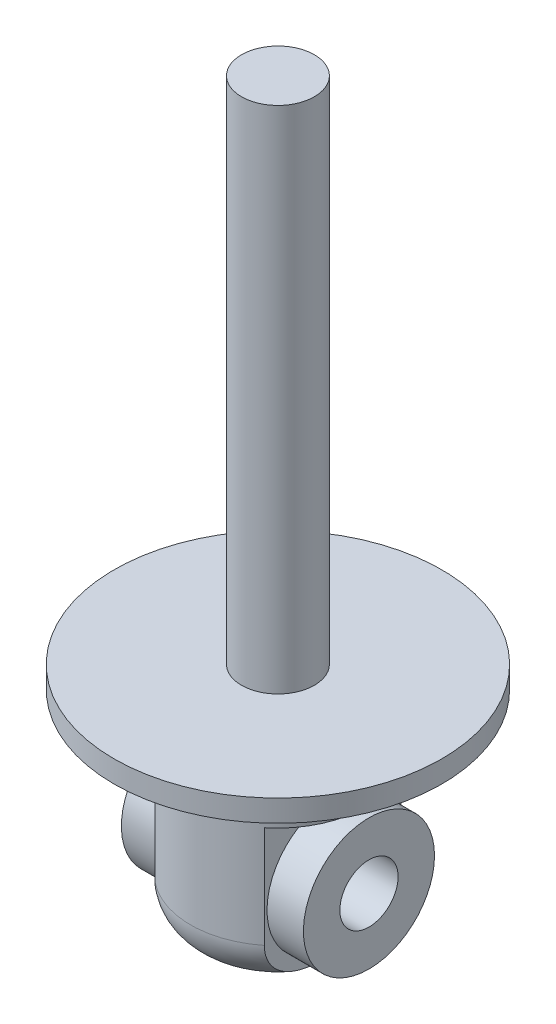
ISO-10303-21;
HEADER;
FILE_DESCRIPTION(('STEP AP214'),'2;1');
FILE_NAME('part.step','',(''),(''),'','','');
FILE_SCHEMA(('AUTOMOTIVE_DESIGN { 1 0 10303 214 1 1 1 1 }'));
ENDSEC;
DATA;
#1=APPLICATION_CONTEXT('core data for automotive mechanical design processes');
#2=APPLICATION_PROTOCOL_DEFINITION('international standard','automotive_design',2000,#1);
#3=PRODUCT_CONTEXT('',#1,'mechanical');
#4=PRODUCT('Part','Part','',(#3));
#5=PRODUCT_RELATED_PRODUCT_CATEGORY('part','',(#4));
#6=PRODUCT_DEFINITION_FORMATION('','',#4);
#7=PRODUCT_DEFINITION_CONTEXT('part definition',#1,'design');
#8=PRODUCT_DEFINITION('design','',#6,#7);
#9=PRODUCT_DEFINITION_SHAPE('','',#8);
#10=(LENGTH_UNIT() NAMED_UNIT(*) SI_UNIT(.MILLI.,.METRE.));
#11=(NAMED_UNIT(*) PLANE_ANGLE_UNIT() SI_UNIT($,.RADIAN.));
#12=(NAMED_UNIT(*) SI_UNIT($,.STERADIAN.) SOLID_ANGLE_UNIT());
#13=UNCERTAINTY_MEASURE_WITH_UNIT(LENGTH_MEASURE(1.E-05),#10,'distance_accuracy_value','');
#14=(GEOMETRIC_REPRESENTATION_CONTEXT(3) GLOBAL_UNCERTAINTY_ASSIGNED_CONTEXT((#13)) GLOBAL_UNIT_ASSIGNED_CONTEXT((#10,
#11,#12)) REPRESENTATION_CONTEXT('',''));
#15=CARTESIAN_POINT('',(0.,0.,0.));
#16=DIRECTION('',(0.,0.,1.));
#17=DIRECTION('',(1.,0.,0.));
#18=AXIS2_PLACEMENT_3D('',#15,#16,#17);
#19=CARTESIAN_POINT('',(-7.5,-8.,-22.5));
#20=DIRECTION('',(1.,0.,0.));
#21=DIRECTION('',(0.,1.,0.));
#22=AXIS2_PLACEMENT_3D('',#19,#20,#21);
#23=PLANE('',#22);
#24=CARTESIAN_POINT('',(-7.5,-27.8094750193111,0.));
#25=CARTESIAN_POINT('',(-7.5,-27.8094752958151,0.18452162824242));
#26=CARTESIAN_POINT('',(-7.5,-27.8077270322999,0.369043480287192));
#27=CARTESIAN_POINT('',(-7.5,-27.8006130628877,0.737999394292285));
#28=CARTESIAN_POINT('',(-7.5,-27.7952477367066,0.922433463434385));
#29=CARTESIAN_POINT('',(-7.5,-27.780538513706,1.29122559425462));
#30=CARTESIAN_POINT('',(-7.5,-27.7711929215574,1.47558358999919));
#31=CARTESIAN_POINT('',(-7.5,-27.7479507640883,1.84401846668315));
#32=CARTESIAN_POINT('',(-7.5,-27.734054140347,2.02809534398339));
#33=CARTESIAN_POINT('',(-7.5,-27.701027325669,2.39498843631837));
#34=CARTESIAN_POINT('',(-7.5,-27.6819201299087,2.57780665418326));
#35=CARTESIAN_POINT('',(-7.5,-27.6375682217561,2.94269408038083));
#36=CARTESIAN_POINT('',(-7.5,-27.6123230495969,3.12476323156505));
#37=CARTESIAN_POINT('',(-7.5,-27.5259360262262,3.6691632505479));
#38=CARTESIAN_POINT('',(-7.5,-27.4541196223952,4.02997739530099));
#39=CARTESIAN_POINT('',(-7.5,-27.315114172541,4.57935988961709));
#40=CARTESIAN_POINT('',(-7.5,-27.2608348848703,4.77122256452969));
#41=CARTESIAN_POINT('',(-7.5,-27.1402411036094,5.15109529504942));
#42=CARTESIAN_POINT('',(-7.5,-27.0739312594077,5.33910680786539));
#43=CARTESIAN_POINT('',(-7.5,-26.928148698992,5.70992505463463));
#44=CARTESIAN_POINT('',(-7.5,-26.8486797977089,5.8927332791208));
#45=CARTESIAN_POINT('',(-7.5,-26.6756224712841,6.25155879665883));
#46=CARTESIAN_POINT('',(-7.5,-26.5820364486502,6.42757723883459));
#47=CARTESIAN_POINT('',(-7.5,-26.3958384208508,6.74413785402998));
#48=CARTESIAN_POINT('',(-7.5,-26.3053527427416,6.8859302136676));
#49=CARTESIAN_POINT('',(-7.5,-26.1136422044668,7.16205254122039));
#50=CARTESIAN_POINT('',(-7.5,-26.0124194056704,7.29638393401336));
#51=CARTESIAN_POINT('',(-7.5,-25.7991822855038,7.55627452274061));
#52=CARTESIAN_POINT('',(-7.5,-25.6871652583255,7.6818315054992));
#53=CARTESIAN_POINT('',(-7.5,-25.4525813942248,7.92270374400352));
#54=CARTESIAN_POINT('',(-7.5,-25.3300144777409,8.03801892249803));
#55=CARTESIAN_POINT('',(-7.5,-25.0736714823962,8.25792234562975));
#56=CARTESIAN_POINT('',(-7.5,-24.9398051473305,8.36240569865935));
#57=CARTESIAN_POINT('',(-7.5,-24.662616920615,8.55796576900281));
#58=CARTESIAN_POINT('',(-7.5,-24.5192963548439,8.64904436046083));
#59=CARTESIAN_POINT('',(-7.5,-24.2243409104845,8.81636481076627));
#60=CARTESIAN_POINT('',(-7.5,-24.0727112205184,8.89261579636783));
#61=CARTESIAN_POINT('',(-7.5,-23.7624095052739,9.02909243430965));
#62=CARTESIAN_POINT('',(-7.5,-23.6037388369551,9.08932115899453));
#63=CARTESIAN_POINT('',(-7.5,-23.3052245459151,9.1849514334904));
#64=CARTESIAN_POINT('',(-7.5,-23.1661361294911,9.22272405795734));
#65=CARTESIAN_POINT('',(-7.5,-22.8851087613884,9.28547940350164));
#66=CARTESIAN_POINT('',(-7.5,-22.7431701638949,9.31046370365637));
#67=CARTESIAN_POINT('',(-7.5,-22.4576599589478,9.34730641699015));
#68=CARTESIAN_POINT('',(-7.5,-22.3140890586128,9.35917031033292));
#69=CARTESIAN_POINT('',(-7.5,-22.0264648581988,9.36963164548865));
#70=CARTESIAN_POINT('',(-7.5,-21.8824115750842,9.36822954903948));
#71=CARTESIAN_POINT('',(-7.5,-21.6061914815275,9.35280339576898));
#72=CARTESIAN_POINT('',(-7.5,-21.4739684759153,9.33976569953801));
#73=CARTESIAN_POINT('',(-7.5,-21.2110534946456,9.3025636387872));
#74=CARTESIAN_POINT('',(-7.5,-21.0803620180608,9.27839574533066));
#75=CARTESIAN_POINT('',(-7.5,-20.8215410609612,9.21922065645586));
#76=CARTESIAN_POINT('',(-7.5,-20.6934101253726,9.18421981495561));
#77=CARTESIAN_POINT('',(-7.5,-20.4404340442512,9.1037455253616));
#78=CARTESIAN_POINT('',(-7.5,-20.3155901493276,9.05826815366643));
#79=CARTESIAN_POINT('',(-7.5,-20.0692031015505,8.95699564520569));
#80=CARTESIAN_POINT('',(-7.5,-19.9476868658852,8.90113499399756));
#81=CARTESIAN_POINT('',(-7.5,-19.7094920695403,8.77987692751897));
#82=CARTESIAN_POINT('',(-7.5,-19.5928152563103,8.71447610526943));
#83=CARTESIAN_POINT('',(-7.5,-19.2509911073174,8.50489875856372));
#84=CARTESIAN_POINT('',(-7.5,-19.0339195251877,8.34729299116935));
#85=CARTESIAN_POINT('',(-7.5,-18.609337427954,7.98870608163153));
#86=CARTESIAN_POINT('',(-7.5,-18.4039002281567,7.78529755950601));
#87=CARTESIAN_POINT('',(-7.5,-18.0246758733926,7.35109040646743));
#88=CARTESIAN_POINT('',(-7.5,-17.8508837047537,7.12029612399675));
#89=CARTESIAN_POINT('',(-7.5,-17.5744409595824,6.69864287979115));
#90=CARTESIAN_POINT('',(-7.5,-17.4648689537028,6.51223410047273));
#91=CARTESIAN_POINT('',(-7.5,-17.2626904112623,6.13034538679086));
#92=CARTESIAN_POINT('',(-7.5,-17.1700919878543,5.93486117014359));
#93=CARTESIAN_POINT('',(-7.5,-17.0006313082269,5.53658641063458));
#94=CARTESIAN_POINT('',(-7.5,-16.9238147555949,5.33377659321381));
#95=CARTESIAN_POINT('',(-7.5,-16.784875362625,4.92331428460811));
#96=CARTESIAN_POINT('',(-7.5,-16.7227484430634,4.71566315546475));
#97=CARTESIAN_POINT('',(-7.5,-16.5386673542946,4.02250667384636));
#98=CARTESIAN_POINT('',(-7.5,-16.4449803111871,3.52942656369882));
#99=CARTESIAN_POINT('',(-7.5,-16.3412352530644,2.78498720051467));
#100=CARTESIAN_POINT('',(-7.5,-16.3127705467372,2.53568557770051));
#101=CARTESIAN_POINT('',(-7.5,-16.2658269581612,2.0361243493744));
#102=CARTESIAN_POINT('',(-7.5,-16.2473468655649,1.78586486368143));
#103=CARTESIAN_POINT('',(-7.5,-16.2184283009414,1.28363112408654));
#104=CARTESIAN_POINT('',(-7.5,-16.208031590786,1.03165466176093));
#105=CARTESIAN_POINT('',(-7.5,-16.1941849220444,0.527501194688693));
#106=CARTESIAN_POINT('',(-7.5,-16.1907352988047,0.275324180848924));
#107=CARTESIAN_POINT('',(-7.5,-16.1903333462322,-0.228731345602963));
#108=CARTESIAN_POINT('',(-7.5,-16.193373232494,-0.480609853630161));
#109=CARTESIAN_POINT('',(-7.5,-16.2063332691715,-0.984173581494253));
#110=CARTESIAN_POINT('',(-7.5,-16.2162528039696,-1.23585881660872));
#111=CARTESIAN_POINT('',(-7.5,-16.2454935008677,-1.76278825668932));
#112=CARTESIAN_POINT('',(-7.5,-16.2656211327378,-2.0379899010917));
#113=CARTESIAN_POINT('',(-7.5,-16.3180418431017,-2.58731345976838));
#114=CARTESIAN_POINT('',(-7.5,-16.3503365349836,-2.86143522597443));
#115=CARTESIAN_POINT('',(-7.5,-16.4300545548583,-3.40623279358436));
#116=CARTESIAN_POINT('',(-7.5,-16.4774071358833,-3.67691867401873));
#117=CARTESIAN_POINT('',(-7.5,-16.5907053400646,-4.21439476079951));
#118=CARTESIAN_POINT('',(-7.5,-16.6566449229111,-4.4811862031647));
#119=CARTESIAN_POINT('',(-7.5,-16.7911834026755,-4.94217748017443));
#120=CARTESIAN_POINT('',(-7.5,-16.8549558474619,-5.13778160857807));
#121=CARTESIAN_POINT('',(-7.5,-16.9961265709521,-5.5239942274174));
#122=CARTESIAN_POINT('',(-7.5,-17.0735207892669,-5.71460418712136));
#123=CARTESIAN_POINT('',(-7.5,-17.2430793617625,-6.08921987221889));
#124=CARTESIAN_POINT('',(-7.5,-17.3352463319138,-6.27322442084438));
#125=CARTESIAN_POINT('',(-7.5,-17.5351759469553,-6.63256976145457));
#126=CARTESIAN_POINT('',(-7.5,-17.6429345063483,-6.80791280693597));
#127=CARTESIAN_POINT('',(-7.5,-17.8487615005736,-7.10989658300674));
#128=CARTESIAN_POINT('',(-7.5,-17.9436617626469,-7.23870103997639));
#129=CARTESIAN_POINT('',(-7.5,-18.143229826346,-7.48856622066219));
#130=CARTESIAN_POINT('',(-7.5,-18.2478987883735,-7.60962602152205));
#131=CARTESIAN_POINT('',(-7.5,-18.4668045949393,-7.84271387792474));
#132=CARTESIAN_POINT('',(-7.5,-18.5810384459287,-7.95474473789612));
#133=CARTESIAN_POINT('',(-7.5,-18.8187268203134,-8.16854933672494));
#134=CARTESIAN_POINT('',(-7.5,-18.9421800591116,-8.27032449994957));
#135=CARTESIAN_POINT('',(-7.5,-19.1987356397018,-8.46313596223061));
#136=CARTESIAN_POINT('',(-7.5,-19.3319055781875,-8.55408255407203));
#137=CARTESIAN_POINT('',(-7.5,-19.6061418402457,-8.72304401015934));
#138=CARTESIAN_POINT('',(-7.5,-19.747204378254,-8.80106500403696));
#139=CARTESIAN_POINT('',(-7.5,-20.0362068877473,-8.94309470867639));
#140=CARTESIAN_POINT('',(-7.5,-20.1841460034049,-9.00710515749598));
#141=CARTESIAN_POINT('',(-7.5,-20.4856380297523,-9.12014361193693));
#142=CARTESIAN_POINT('',(-7.5,-20.6391901444676,-9.16917373274798));
#143=CARTESIAN_POINT('',(-7.5,-20.9313639562727,-9.24643392787081));
#144=CARTESIAN_POINT('',(-7.5,-21.0695088202567,-9.2764768563288));
#145=CARTESIAN_POINT('',(-7.5,-21.3479315795213,-9.32406143536891));
#146=CARTESIAN_POINT('',(-7.5,-21.4882092809526,-9.34160421520928));
#147=CARTESIAN_POINT('',(-7.5,-21.769719609589,-9.36396002322678));
#148=CARTESIAN_POINT('',(-7.5,-21.9109518422674,-9.36877802253041));
#149=CARTESIAN_POINT('',(-7.5,-22.1932734390957,-9.36563613906261));
#150=CARTESIAN_POINT('',(-7.5,-22.3343628067459,-9.35767657732182));
#151=CARTESIAN_POINT('',(-7.5,-22.6064011749062,-9.32998563551062));
#152=CARTESIAN_POINT('',(-7.5,-22.7374295539783,-9.31102660205279));
#153=CARTESIAN_POINT('',(-7.5,-22.9974780227225,-9.26218788836622));
#154=CARTESIAN_POINT('',(-7.5,-23.1264974548056,-9.23230470755187));
#155=CARTESIAN_POINT('',(-7.5,-23.3815508516768,-9.16196479385525));
#156=CARTESIAN_POINT('',(-7.5,-23.5075862018083,-9.12151307666088));
#157=CARTESIAN_POINT('',(-7.5,-23.7559772755244,-9.03044888037393));
#158=CARTESIAN_POINT('',(-7.5,-23.8783315975104,-8.97983258590814));
#159=CARTESIAN_POINT('',(-7.5,-24.1205569584555,-8.8680617574251));
#160=CARTESIAN_POINT('',(-7.5,-24.2403549182387,-8.80674877020291));
#161=CARTESIAN_POINT('',(-7.5,-24.4747211723639,-8.67480187441993));
#162=CARTESIAN_POINT('',(-7.5,-24.5892875713423,-8.60416462323317));
#163=CARTESIAN_POINT('',(-7.5,-24.9242270275788,-8.37928997825773));
#164=CARTESIAN_POINT('',(-7.5,-25.13600210755,-8.21201407264852));
#165=CARTESIAN_POINT('',(-7.5,-25.5504485361803,-7.832942739178));
#166=CARTESIAN_POINT('',(-7.5,-25.7507010772538,-7.618532285847));
#167=CARTESIAN_POINT('',(-7.5,-26.1185076671662,-7.16337882817298));
#168=CARTESIAN_POINT('',(-7.5,-26.2860513710234,-6.9226275303298));
#169=CARTESIAN_POINT('',(-7.5,-26.5545024709803,-6.4788664395953));
#170=CARTESIAN_POINT('',(-7.5,-26.6619013252763,-6.279707295078));
#171=CARTESIAN_POINT('',(-7.5,-26.858559219587,-5.87254463104013));
#172=CARTESIAN_POINT('',(-7.5,-26.9478095430477,-5.66453691936401));
#173=CARTESIAN_POINT('',(-7.5,-27.1096214973705,-5.24180758530233));
#174=CARTESIAN_POINT('',(-7.5,-27.1821555960046,-5.02707553901332));
#175=CARTESIAN_POINT('',(-7.5,-27.3121001369762,-4.59305326757356));
#176=CARTESIAN_POINT('',(-7.5,-27.3695048137837,-4.37376133898657));
#177=CARTESIAN_POINT('',(-7.5,-27.4981886749365,-3.81417726059937));
#178=CARTESIAN_POINT('',(-7.5,-27.5604951716191,-3.4718329690517));
#179=CARTESIAN_POINT('',(-7.5,-27.6609019684328,-2.7835920061487));
#180=CARTESIAN_POINT('',(-7.5,-27.6989863972919,-2.43769315620305));
#181=CARTESIAN_POINT('',(-7.5,-27.7425563308733,-1.91723181279188));
#182=CARTESIAN_POINT('',(-7.5,-27.7548291128016,-1.74318957751326));
#183=CARTESIAN_POINT('',(-7.5,-27.7753986995787,-1.39487161182967));
#184=CARTESIAN_POINT('',(-7.5,-27.7836956019396,-1.22059588725638));
#185=CARTESIAN_POINT('',(-7.5,-27.796777523185,-0.87196539298604));
#186=CARTESIAN_POINT('',(-7.5,-27.8015635129394,-0.697610658492171));
#187=CARTESIAN_POINT('',(-7.5,-27.8079121855994,-0.348837350643893));
#188=CARTESIAN_POINT('',(-7.5,-27.8094747579462,-0.174418775305038));
#189=CARTESIAN_POINT('',(-7.5,-27.8094750193111,0.));
#190=B_SPLINE_CURVE_WITH_KNOTS('',3,(#24,#25,#26,#27,#28,#29,#30,#31,#32,#33,#34,#35,#36,#37,
#38,#39,#40,#41,#42,#43,#44,#45,#46,#47,#48,#49,#50,#51,#52,#53,#54,#55,#56,#57,#58,#59,#60,#61,
#62,#63,#64,#65,#66,#67,#68,#69,#70,#71,#72,#73,#74,#75,#76,#77,#78,#79,#80,#81,#82,#83,#84,#85,
#86,#87,#88,#89,#90,#91,#92,#93,#94,#95,#96,#97,#98,#99,#100,#101,#102,#103,#104,#105,#106,#107,
#108,#109,#110,#111,#112,#113,#114,#115,#116,#117,#118,#119,#120,#121,#122,#123,#124,#125,#126,
#127,#128,#129,#130,#131,#132,#133,#134,#135,#136,#137,#138,#139,#140,#141,#142,#143,#144,#145,
#146,#147,#148,#149,#150,#151,#152,#153,#154,#155,#156,#157,#158,#159,#160,#161,#162,#163,#164,
#165,#166,#167,#168,#169,#170,#171,#172,#173,#174,#175,#176,#177,#178,#179,#180,#181,#182,#183,
#184,#185,#186,#187,#188,#189),.UNSPECIFIED.,.T.,.F.,(4,2,2,2,2,2,2,2,2,2,2,2,2,2,2,2,2,2,2,2,2,
2,2,2,2,2,2,2,2,2,2,2,2,2,2,2,2,2,2,2,2,2,2,2,2,2,2,2,2,2,2,2,2,2,2,2,2,2,2,2,2,2,2,2,2,2,2,2,2,
2,2,2,2,2,2,2,2,2,2,2,2,2,4),(0.,0.553556541747908,1.10705498067111,1.66078940935171,
2.21453094651203,2.7658672034967,3.31724477121585,4.41912680182767,5.01698525599297,
5.61461314908642,6.21206808675634,6.80942146164093,7.31357153503217,7.81762499361292,
8.32180513447662,8.82598907791493,9.33467160980088,9.84328295415676,10.3515802378956,
10.8597799828438,11.291588037567,11.7233427606026,12.1549170790764,12.5864763761707,
12.9845986570771,13.3828472534997,13.7808627038906,14.1790274594522,14.579795450788,
14.9807069160888,15.7821103743006,16.6461503316802,17.5100532757815,18.1578732554314,
18.8060020817716,19.4559821948789,20.1057815998326,21.6069748462105,22.3596793389022,
23.1122925673176,23.8687687149109,24.6252813779039,25.3808870860739,26.1364251884592,
26.9640249034878,27.7917343993232,28.6156111127982,29.4392203950451,30.0559954213972,
30.6725869093733,31.2892877047367,31.9058271963483,32.3853559200308,32.8649416785199,
33.3443778968313,33.823747436381,34.3068464150844,34.7897156366604,35.2725249226045,
35.7552660053908,36.1788379642465,36.6023716529343,37.0257398573389,37.4490974249689,
37.8458122806135,38.2426543730445,38.639308470493,39.0361117351622,39.4393886143668,
39.8428104576492,40.6491243408277,41.5260051520067,42.403162850804,43.0810551134699,
43.7592721958252,44.4385984678267,45.1181832448308,46.1608437011148,47.2041866484774,
47.7275747628343,48.2509500399341,48.7741805338585,49.2974289735857),.UNSPECIFIED.);
#191=CARTESIAN_POINT('',(-7.5,-22.,-9.3674969975976));
#192=VERTEX_POINT('',#191);
#193=CARTESIAN_POINT('',(-7.5,-21.9999999999999,9.36749699759766));
#194=VERTEX_POINT('',#193);
#195=EDGE_CURVE('E136',#192,#194,#190,.T.);
#196=ORIENTED_EDGE('',*,*,#195,.T.);
#197=DIRECTION('',(0.,1.,0.));
#198=VECTOR('',#197,1.);
#199=CARTESIAN_POINT('',(-7.5,-28.,9.3674969975976));
#200=LINE('',#199,#198);
#201=CARTESIAN_POINT('',(-7.5,-8.,9.36749699759759));
#202=VERTEX_POINT('',#201);
#203=EDGE_CURVE('E99',#202,#194,#200,.F.);
#204=ORIENTED_EDGE('',*,*,#203,.F.);
#205=DIRECTION('',(0.,0.,1.));
#206=VECTOR('',#205,1.);
#207=CARTESIAN_POINT('',(-7.5,-8.,-22.5));
#208=LINE('',#207,#206);
#209=CARTESIAN_POINT('',(-7.5,-8.,-9.36749699759761));
#210=VERTEX_POINT('',#209);
#211=EDGE_CURVE('E92',#210,#202,#208,.T.);
#212=ORIENTED_EDGE('',*,*,#211,.F.);
#213=DIRECTION('',(0.,1.,0.));
#214=VECTOR('',#213,1.);
#215=CARTESIAN_POINT('',(-7.5,-28.,-9.3674969975976));
#216=LINE('',#215,#214);
#217=EDGE_CURVE('E70',#192,#210,#216,.T.);
#218=ORIENTED_EDGE('',*,*,#217,.F.);
#219=EDGE_LOOP('',(#196,#204,#212,#218));
#220=FACE_BOUND('',#219,.T.);
#221=CARTESIAN_POINT('',(-7.5,-18.,0.));
#222=DIRECTION('',(1.,0.,0.));
#223=DIRECTION('',(0.,1.,0.));
#224=AXIS2_PLACEMENT_3D('',#221,#222,#223);
#225=CIRCLE('',#224,9.);
#226=CARTESIAN_POINT('',(-7.5,-9.,0.));
#227=VERTEX_POINT('',#226);
#228=EDGE_CURVE('E11',#227,#227,#225,.F.);
#229=ORIENTED_EDGE('',*,*,#228,.F.);
#230=EDGE_LOOP('',(#229));
#231=FACE_BOUND('',#230,.T.);
#232=ADVANCED_FACE('F45',(#220,#231),#23,.F.);
#233=CARTESIAN_POINT('',(7.5,-8.,-22.5));
#234=DIRECTION('',(-1.,0.,0.));
#235=DIRECTION('',(0.,-1.,0.));
#236=AXIS2_PLACEMENT_3D('',#233,#234,#235);
#237=PLANE('',#236);
#238=CARTESIAN_POINT('',(7.5,-27.8094750193111,0.));
#239=CARTESIAN_POINT('',(7.5,-27.8094752958151,-0.18452162824242));
#240=CARTESIAN_POINT('',(7.5,-27.8077270322999,-0.369043480287192));
#241=CARTESIAN_POINT('',(7.5,-27.8006130628877,-0.737999394292286));
#242=CARTESIAN_POINT('',(7.5,-27.7952477367066,-0.922433463434386));
#243=CARTESIAN_POINT('',(7.5,-27.780538513706,-1.29122559425462));
#244=CARTESIAN_POINT('',(7.5,-27.7711929215574,-1.47558358999919));
#245=CARTESIAN_POINT('',(7.5,-27.7479507640883,-1.84401846668315));
#246=CARTESIAN_POINT('',(7.5,-27.734054140347,-2.0280953439834));
#247=CARTESIAN_POINT('',(7.5,-27.701027325669,-2.39498843631837));
#248=CARTESIAN_POINT('',(7.5,-27.6819201299087,-2.57780665418327));
#249=CARTESIAN_POINT('',(7.5,-27.6375682217561,-2.94269408038084));
#250=CARTESIAN_POINT('',(7.5,-27.6123230495969,-3.12476323156505));
#251=CARTESIAN_POINT('',(7.5,-27.5259360262262,-3.6691632505479));
#252=CARTESIAN_POINT('',(7.5,-27.4541196223952,-4.029977395301));
#253=CARTESIAN_POINT('',(7.5,-27.315114172541,-4.57935988961709));
#254=CARTESIAN_POINT('',(7.5,-27.2608348848703,-4.7712225645297));
#255=CARTESIAN_POINT('',(7.5,-27.1402411036094,-5.15109529504943));
#256=CARTESIAN_POINT('',(7.5,-27.0739312594077,-5.3391068078654));
#257=CARTESIAN_POINT('',(7.5,-26.9281486989919,-5.70992505463463));
#258=CARTESIAN_POINT('',(7.5,-26.8486797977089,-5.8927332791208));
#259=CARTESIAN_POINT('',(7.5,-26.6756224712841,-6.25155879665883));
#260=CARTESIAN_POINT('',(7.5,-26.5820364486501,-6.4275772388346));
#261=CARTESIAN_POINT('',(7.5,-26.3958384208508,-6.74413785402998));
#262=CARTESIAN_POINT('',(7.5,-26.3053527427416,-6.8859302136676));
#263=CARTESIAN_POINT('',(7.5,-26.1136422044668,-7.16205254122039));
#264=CARTESIAN_POINT('',(7.5,-26.0124194056704,-7.29638393401336));
#265=CARTESIAN_POINT('',(7.5,-25.7991822855038,-7.55627452274061));
#266=CARTESIAN_POINT('',(7.5,-25.6871652583255,-7.6818315054992));
#267=CARTESIAN_POINT('',(7.5,-25.4525813942248,-7.92270374400352));
#268=CARTESIAN_POINT('',(7.5,-25.3300144777409,-8.03801892249803));
#269=CARTESIAN_POINT('',(7.5,-25.0736714823962,-8.25792234562975));
#270=CARTESIAN_POINT('',(7.5,-24.9398051473305,-8.36240569865935));
#271=CARTESIAN_POINT('',(7.5,-24.662616920615,-8.55796576900282));
#272=CARTESIAN_POINT('',(7.5,-24.5192963548439,-8.64904436046083));
#273=CARTESIAN_POINT('',(7.5,-24.2243409104845,-8.81636481076627));
#274=CARTESIAN_POINT('',(7.5,-24.0727112205184,-8.89261579636783));
#275=CARTESIAN_POINT('',(7.5,-23.7624095052739,-9.02909243430965));
#276=CARTESIAN_POINT('',(7.5,-23.6037388369551,-9.08932115899453));
#277=CARTESIAN_POINT('',(7.5,-23.3052245459151,-9.1849514334904));
#278=CARTESIAN_POINT('',(7.5,-23.166136129491,-9.22272405795733));
#279=CARTESIAN_POINT('',(7.5,-22.8851087613884,-9.28547940350164));
#280=CARTESIAN_POINT('',(7.5,-22.7431701638949,-9.31046370365637));
#281=CARTESIAN_POINT('',(7.5,-22.4576599589478,-9.34730641699015));
#282=CARTESIAN_POINT('',(7.5,-22.3140890586128,-9.35917031033292));
#283=CARTESIAN_POINT('',(7.5,-22.0264648581988,-9.36963164548865));
#284=CARTESIAN_POINT('',(7.5,-21.8824115750842,-9.36822954903947));
#285=CARTESIAN_POINT('',(7.5,-21.6061914815275,-9.35280339576898));
#286=CARTESIAN_POINT('',(7.5,-21.4739684759153,-9.33976569953801));
#287=CARTESIAN_POINT('',(7.5,-21.2110534946456,-9.3025636387872));
#288=CARTESIAN_POINT('',(7.5,-21.0803620180608,-9.27839574533066));
#289=CARTESIAN_POINT('',(7.5,-20.8215410609612,-9.21922065645586));
#290=CARTESIAN_POINT('',(7.5,-20.6934101253726,-9.1842198149556));
#291=CARTESIAN_POINT('',(7.5,-20.4404340442512,-9.1037455253616));
#292=CARTESIAN_POINT('',(7.5,-20.3155901493276,-9.05826815366643));
#293=CARTESIAN_POINT('',(7.5,-20.0692031015505,-8.95699564520569));
#294=CARTESIAN_POINT('',(7.5,-19.9476868658852,-8.90113499399755));
#295=CARTESIAN_POINT('',(7.5,-19.7094920695403,-8.77987692751896));
#296=CARTESIAN_POINT('',(7.5,-19.5928152563103,-8.71447610526942));
#297=CARTESIAN_POINT('',(7.5,-19.2509911073174,-8.50489875856371));
#298=CARTESIAN_POINT('',(7.5,-19.0339195251877,-8.34729299116934));
#299=CARTESIAN_POINT('',(7.5,-18.609337427954,-7.98870608163152));
#300=CARTESIAN_POINT('',(7.5,-18.4039002281567,-7.785297559506));
#301=CARTESIAN_POINT('',(7.5,-18.0246758733926,-7.35109040646742));
#302=CARTESIAN_POINT('',(7.5,-17.8508837047537,-7.12029612399674));
#303=CARTESIAN_POINT('',(7.5,-17.5744409595824,-6.69864287979115));
#304=CARTESIAN_POINT('',(7.5,-17.4648689537028,-6.51223410047273));
#305=CARTESIAN_POINT('',(7.5,-17.2626904112623,-6.13034538679085));
#306=CARTESIAN_POINT('',(7.5,-17.1700919878543,-5.93486117014358));
#307=CARTESIAN_POINT('',(7.5,-17.0006313082269,-5.53658641063457));
#308=CARTESIAN_POINT('',(7.5,-16.9238147555949,-5.3337765932138));
#309=CARTESIAN_POINT('',(7.5,-16.784875362625,-4.92331428460809));
#310=CARTESIAN_POINT('',(7.5,-16.7227484430634,-4.71566315546473));
#311=CARTESIAN_POINT('',(7.5,-16.5386673542946,-4.02250667384634));
#312=CARTESIAN_POINT('',(7.5,-16.4449803111871,-3.5294265636988));
#313=CARTESIAN_POINT('',(7.5,-16.3412352530644,-2.78498720051465));
#314=CARTESIAN_POINT('',(7.5,-16.3127705467372,-2.53568557770048));
#315=CARTESIAN_POINT('',(7.5,-16.2658269581612,-2.03612434937437));
#316=CARTESIAN_POINT('',(7.5,-16.2473468655649,-1.78586486368141));
#317=CARTESIAN_POINT('',(7.5,-16.2184283009414,-1.28363112408651));
#318=CARTESIAN_POINT('',(7.5,-16.208031590786,-1.0316546617609));
#319=CARTESIAN_POINT('',(7.5,-16.1941849220444,-0.527501194688664));
#320=CARTESIAN_POINT('',(7.5,-16.1907352988047,-0.275324180848894));
#321=CARTESIAN_POINT('',(7.5,-16.1903333462322,0.228731345602993));
#322=CARTESIAN_POINT('',(7.5,-16.193373232494,0.480609853630191));
#323=CARTESIAN_POINT('',(7.5,-16.2063332691715,0.984173581494284));
#324=CARTESIAN_POINT('',(7.5,-16.2162528039696,1.23585881660876));
#325=CARTESIAN_POINT('',(7.5,-16.2454935008677,1.76278825668935));
#326=CARTESIAN_POINT('',(7.5,-16.2656211327378,2.03798990109173));
#327=CARTESIAN_POINT('',(7.5,-16.3180418431017,2.5873134597684));
#328=CARTESIAN_POINT('',(7.5,-16.3503365349836,2.86143522597445));
#329=CARTESIAN_POINT('',(7.5,-16.4300545548583,3.40623279358438));
#330=CARTESIAN_POINT('',(7.5,-16.4774071358833,3.67691867401874));
#331=CARTESIAN_POINT('',(7.5,-16.5907053400646,4.21439476079952));
#332=CARTESIAN_POINT('',(7.5,-16.6566449229111,4.48118620316471));
#333=CARTESIAN_POINT('',(7.5,-16.7911834026755,4.94217748017443));
#334=CARTESIAN_POINT('',(7.5,-16.8549558474619,5.13778160857808));
#335=CARTESIAN_POINT('',(7.5,-16.9961265709521,5.5239942274174));
#336=CARTESIAN_POINT('',(7.5,-17.073520789267,5.71460418712137));
#337=CARTESIAN_POINT('',(7.5,-17.2430793617625,6.0892198722189));
#338=CARTESIAN_POINT('',(7.5,-17.3352463319138,6.27322442084439));
#339=CARTESIAN_POINT('',(7.5,-17.5351759469553,6.63256976145458));
#340=CARTESIAN_POINT('',(7.5,-17.6429345063483,6.80791280693598));
#341=CARTESIAN_POINT('',(7.5,-17.8487615005737,7.10989658300674));
#342=CARTESIAN_POINT('',(7.5,-17.9436617626469,7.2387010399764));
#343=CARTESIAN_POINT('',(7.5,-18.143229826346,7.4885662206622));
#344=CARTESIAN_POINT('',(7.5,-18.2478987883735,7.60962602152205));
#345=CARTESIAN_POINT('',(7.5,-18.4668045949393,7.84271387792475));
#346=CARTESIAN_POINT('',(7.5,-18.5810384459287,7.95474473789613));
#347=CARTESIAN_POINT('',(7.5,-18.8187268203134,8.16854933672495));
#348=CARTESIAN_POINT('',(7.5,-18.9421800591116,8.27032449994957));
#349=CARTESIAN_POINT('',(7.5,-19.1987356397018,8.46313596223061));
#350=CARTESIAN_POINT('',(7.5,-19.3319055781875,8.55408255407202));
#351=CARTESIAN_POINT('',(7.5,-19.6061418402457,8.72304401015933));
#352=CARTESIAN_POINT('',(7.5,-19.747204378254,8.80106500403696));
#353=CARTESIAN_POINT('',(7.5,-20.0362068877473,8.94309470867639));
#354=CARTESIAN_POINT('',(7.5,-20.1841460034049,9.00710515749598));
#355=CARTESIAN_POINT('',(7.5,-20.4856380297523,9.12014361193692));
#356=CARTESIAN_POINT('',(7.5,-20.6391901444676,9.16917373274798));
#357=CARTESIAN_POINT('',(7.5,-20.9313639562727,9.24643392787081));
#358=CARTESIAN_POINT('',(7.5,-21.0695088202567,9.27647685632879));
#359=CARTESIAN_POINT('',(7.5,-21.3479315795213,9.32406143536891));
#360=CARTESIAN_POINT('',(7.5,-21.4882092809527,9.34160421520928));
#361=CARTESIAN_POINT('',(7.5,-21.769719609589,9.36396002322678));
#362=CARTESIAN_POINT('',(7.5,-21.9109518422674,9.36877802253041));
#363=CARTESIAN_POINT('',(7.5,-22.1932734390957,9.3656361390626));
#364=CARTESIAN_POINT('',(7.5,-22.3343628067459,9.35767657732181));
#365=CARTESIAN_POINT('',(7.5,-22.6064011749062,9.32998563551062));
#366=CARTESIAN_POINT('',(7.5,-22.7374295539783,9.31102660205278));
#367=CARTESIAN_POINT('',(7.5,-22.9974780227225,9.26218788836621));
#368=CARTESIAN_POINT('',(7.5,-23.1264974548056,9.23230470755187));
#369=CARTESIAN_POINT('',(7.5,-23.3815508516768,9.16196479385525));
#370=CARTESIAN_POINT('',(7.5,-23.5075862018083,9.12151307666088));
#371=CARTESIAN_POINT('',(7.5,-23.7559772755244,9.03044888037393));
#372=CARTESIAN_POINT('',(7.5,-23.8783315975104,8.97983258590813));
#373=CARTESIAN_POINT('',(7.5,-24.1205569584555,8.86806175742509));
#374=CARTESIAN_POINT('',(7.5,-24.2403549182387,8.8067487702029));
#375=CARTESIAN_POINT('',(7.5,-24.4747211723639,8.67480187441993));
#376=CARTESIAN_POINT('',(7.5,-24.5892875713423,8.60416462323316));
#377=CARTESIAN_POINT('',(7.5,-24.9242270275788,8.37928997825772));
#378=CARTESIAN_POINT('',(7.5,-25.13600210755,8.21201407264851));
#379=CARTESIAN_POINT('',(7.5,-25.5504485361803,7.83294273917799));
#380=CARTESIAN_POINT('',(7.5,-25.7507010772538,7.61853228584699));
#381=CARTESIAN_POINT('',(7.5,-26.1185076671662,7.16337882817297));
#382=CARTESIAN_POINT('',(7.5,-26.2860513710234,6.92262753032979));
#383=CARTESIAN_POINT('',(7.5,-26.5545024709803,6.47886643959529));
#384=CARTESIAN_POINT('',(7.5,-26.6619013252763,6.27970729507799));
#385=CARTESIAN_POINT('',(7.5,-26.858559219587,5.87254463104012));
#386=CARTESIAN_POINT('',(7.5,-26.9478095430477,5.664536919364));
#387=CARTESIAN_POINT('',(7.5,-27.1096214973705,5.24180758530232));
#388=CARTESIAN_POINT('',(7.5,-27.1821555960046,5.02707553901331));
#389=CARTESIAN_POINT('',(7.5,-27.3121001369762,4.59305326757355));
#390=CARTESIAN_POINT('',(7.5,-27.3695048137837,4.37376133898655));
#391=CARTESIAN_POINT('',(7.5,-27.4981886749365,3.81417726059936));
#392=CARTESIAN_POINT('',(7.5,-27.5604951716191,3.47183296905169));
#393=CARTESIAN_POINT('',(7.5,-27.6609019684328,2.78359200614869));
#394=CARTESIAN_POINT('',(7.5,-27.6989863972919,2.43769315620304));
#395=CARTESIAN_POINT('',(7.5,-27.7425563308733,1.91723181279187));
#396=CARTESIAN_POINT('',(7.5,-27.7548291128016,1.74318957751326));
#397=CARTESIAN_POINT('',(7.5,-27.7753986995787,1.39487161182966));
#398=CARTESIAN_POINT('',(7.5,-27.7836956019396,1.22059588725638));
#399=CARTESIAN_POINT('',(7.5,-27.796777523185,0.871965392986033));
#400=CARTESIAN_POINT('',(7.5,-27.8015635129394,0.697610658492164));
#401=CARTESIAN_POINT('',(7.5,-27.8079121855994,0.348837350643889));
#402=CARTESIAN_POINT('',(7.5,-27.8094747579462,0.174418775305036));
#403=CARTESIAN_POINT('',(7.5,-27.8094750193111,0.));
#404=B_SPLINE_CURVE_WITH_KNOTS('',3,(#238,#239,#240,#241,#242,#243,#244,#245,#246,#247,#248,
#249,#250,#251,#252,#253,#254,#255,#256,#257,#258,#259,#260,#261,#262,#263,#264,#265,#266,#267,
#268,#269,#270,#271,#272,#273,#274,#275,#276,#277,#278,#279,#280,#281,#282,#283,#284,#285,#286,
#287,#288,#289,#290,#291,#292,#293,#294,#295,#296,#297,#298,#299,#300,#301,#302,#303,#304,#305,
#306,#307,#308,#309,#310,#311,#312,#313,#314,#315,#316,#317,#318,#319,#320,#321,#322,#323,#324,
#325,#326,#327,#328,#329,#330,#331,#332,#333,#334,#335,#336,#337,#338,#339,#340,#341,#342,#343,
#344,#345,#346,#347,#348,#349,#350,#351,#352,#353,#354,#355,#356,#357,#358,#359,#360,#361,#362,
#363,#364,#365,#366,#367,#368,#369,#370,#371,#372,#373,#374,#375,#376,#377,#378,#379,#380,#381,
#382,#383,#384,#385,#386,#387,#388,#389,#390,#391,#392,#393,#394,#395,#396,#397,#398,#399,#400,
#401,#402,#403),.UNSPECIFIED.,.T.,.F.,(4,2,2,2,2,2,2,2,2,2,2,2,2,2,2,2,2,2,2,2,2,2,2,2,2,2,2,2,
2,2,2,2,2,2,2,2,2,2,2,2,2,2,2,2,2,2,2,2,2,2,2,2,2,2,2,2,2,2,2,2,2,2,2,2,2,2,2,2,2,2,2,2,2,2,2,2,
2,2,2,2,2,2,4),(0.,0.553556541747909,1.10705498067111,1.66078940935171,2.21453094651203,
2.7658672034967,3.31724477121586,4.41912680182767,5.01698525599298,5.61461314908642,
6.21206808675634,6.80942146164093,7.31357153503217,7.81762499361292,8.32180513447662,
8.82598907791493,9.33467160980088,9.84328295415677,10.3515802378956,10.8597799828438,
11.291588037567,11.7233427606026,12.1549170790764,12.5864763761706,12.9845986570771,
13.3828472534997,13.7808627038906,14.1790274594522,14.579795450788,14.9807069160888,
15.7821103743006,16.6461503316802,17.5100532757815,18.1578732554314,18.8060020817716,
19.4559821948789,20.1057815998326,21.6069748462106,22.3596793389022,23.1122925673176,
23.8687687149109,24.6252813779039,25.3808870860739,26.1364251884592,26.9640249034878,
27.7917343993232,28.6156111127982,29.4392203950451,30.0559954213971,30.6725869093732,
31.2892877047367,31.9058271963483,32.3853559200308,32.8649416785199,33.3443778968313,
33.823747436381,34.3068464150843,34.7897156366603,35.2725249226045,35.7552660053908,
36.1788379642465,36.6023716529343,37.0257398573389,37.4490974249689,37.8458122806135,
38.2426543730445,38.639308470493,39.0361117351622,39.4393886143668,39.8428104576492,
40.6491243408277,41.5260051520067,42.4031628508039,43.0810551134699,43.7592721958252,
44.4385984678267,45.1181832448308,46.1608437011148,47.2041866484774,47.7275747628343,
48.2509500399341,48.7741805338585,49.2974289735857),.UNSPECIFIED.);
#405=CARTESIAN_POINT('',(7.5,-22.,9.3674969975976));
#406=VERTEX_POINT('',#405);
#407=CARTESIAN_POINT('',(7.5,-21.9999999999999,-9.36749699759765));
#408=VERTEX_POINT('',#407);
#409=EDGE_CURVE('E96',#406,#408,#404,.T.);
#410=ORIENTED_EDGE('',*,*,#409,.T.);
#411=DIRECTION('',(0.,1.,0.));
#412=VECTOR('',#411,1.);
#413=CARTESIAN_POINT('',(7.5,-28.,-9.3674969975976));
#414=LINE('',#413,#412);
#415=CARTESIAN_POINT('',(7.5,-8.,-9.3674969975976));
#416=VERTEX_POINT('',#415);
#417=EDGE_CURVE('E110',#416,#408,#414,.F.);
#418=ORIENTED_EDGE('',*,*,#417,.F.);
#419=DIRECTION('',(0.,0.,1.));
#420=VECTOR('',#419,1.);
#421=CARTESIAN_POINT('',(7.5,-8.,-22.5));
#422=LINE('',#421,#420);
#423=CARTESIAN_POINT('',(7.5,-8.,9.3674969975976));
#424=VERTEX_POINT('',#423);
#425=EDGE_CURVE('E100',#416,#424,#422,.T.);
#426=ORIENTED_EDGE('',*,*,#425,.T.);
#427=DIRECTION('',(0.,1.,0.));
#428=VECTOR('',#427,1.);
#429=CARTESIAN_POINT('',(7.5,-28.,9.3674969975976));
#430=LINE('',#429,#428);
#431=EDGE_CURVE('E62',#406,#424,#430,.T.);
#432=ORIENTED_EDGE('',*,*,#431,.F.);
#433=EDGE_LOOP('',(#410,#418,#426,#432));
#434=FACE_BOUND('',#433,.T.);
#435=CARTESIAN_POINT('',(7.5,-18.,0.));
#436=DIRECTION('',(-1.,0.,0.));
#437=DIRECTION('',(0.,-1.,0.));
#438=AXIS2_PLACEMENT_3D('',#435,#436,#437);
#439=CIRCLE('',#438,9.);
#440=CARTESIAN_POINT('',(7.5,-27.,0.));
#441=VERTEX_POINT('',#440);
#442=EDGE_CURVE('E50',#441,#441,#439,.F.);
#443=ORIENTED_EDGE('',*,*,#442,.F.);
#444=EDGE_LOOP('',(#443));
#445=FACE_BOUND('',#444,.T.);
#446=ADVANCED_FACE('F150',(#434,#445),#237,.F.);
#447=CARTESIAN_POINT('',(0.,3.,0.));
#448=DIRECTION('',(0.,-1.,0.));
#449=DIRECTION('',(0.,0.,-1.));
#450=AXIS2_PLACEMENT_3D('',#447,#448,#449);
#451=CYLINDRICAL_SURFACE('',#450,22.5);
#452=CARTESIAN_POINT('',(0.,3.,0.));
#453=DIRECTION('',(0.,1.,0.));
#454=DIRECTION('',(0.,0.,1.));
#455=AXIS2_PLACEMENT_3D('',#452,#453,#454);
#456=CIRCLE('',#455,22.5);
#457=CARTESIAN_POINT('',(0.,3.,22.5));
#458=VERTEX_POINT('',#457);
#459=EDGE_CURVE('E127',#458,#458,#456,.T.);
#460=ORIENTED_EDGE('',*,*,#459,.F.);
#461=EDGE_LOOP('',(#460));
#462=FACE_BOUND('',#461,.T.);
#463=CARTESIAN_POINT('',(0.,0.,0.));
#464=DIRECTION('',(0.,1.,0.));
#465=DIRECTION('',(0.,0.,1.));
#466=AXIS2_PLACEMENT_3D('',#463,#464,#465);
#467=CIRCLE('',#466,22.5);
#468=CARTESIAN_POINT('',(0.,0.,22.5));
#469=VERTEX_POINT('',#468);
#470=EDGE_CURVE('E124',#469,#469,#467,.T.);
#471=ORIENTED_EDGE('',*,*,#470,.T.);
#472=EDGE_LOOP('',(#471));
#473=FACE_BOUND('',#472,.T.);
#474=ADVANCED_FACE('F169',(#462,#473),#451,.T.);
#475=CARTESIAN_POINT('',(0.,3.,0.));
#476=DIRECTION('',(0.,1.,0.));
#477=DIRECTION('',(0.,0.,1.));
#478=AXIS2_PLACEMENT_3D('',#475,#476,#477);
#479=PLANE('',#478);
#480=CARTESIAN_POINT('',(0.,3.,0.));
#481=DIRECTION('',(0.,1.,0.));
#482=DIRECTION('',(0.,0.,1.));
#483=AXIS2_PLACEMENT_3D('',#480,#481,#482);
#484=CIRCLE('',#483,5.);
#485=CARTESIAN_POINT('',(0.,3.,5.));
#486=VERTEX_POINT('',#485);
#487=EDGE_CURVE('E121',#486,#486,#484,.T.);
#488=ORIENTED_EDGE('',*,*,#487,.F.);
#489=EDGE_LOOP('',(#488));
#490=FACE_BOUND('',#489,.T.);
#491=ORIENTED_EDGE('',*,*,#459,.T.);
#492=EDGE_LOOP('',(#491));
#493=FACE_BOUND('',#492,.T.);
#494=ADVANCED_FACE('F166',(#490,#493),#479,.T.);
#495=CARTESIAN_POINT('',(0.,0.,0.));
#496=DIRECTION('',(0.,1.,0.));
#497=DIRECTION('',(0.,0.,1.));
#498=AXIS2_PLACEMENT_3D('',#495,#496,#497);
#499=PLANE('',#498);
#500=CARTESIAN_POINT('',(0.,0.,0.));
#501=DIRECTION('',(0.,-1.,0.));
#502=DIRECTION('',(0.,0.,-1.));
#503=AXIS2_PLACEMENT_3D('',#500,#501,#502);
#504=CIRCLE('',#503,12.);
#505=CARTESIAN_POINT('',(0.,0.,-12.));
#506=VERTEX_POINT('',#505);
#507=EDGE_CURVE('E117',#506,#506,#504,.T.);
#508=ORIENTED_EDGE('',*,*,#507,.F.);
#509=EDGE_LOOP('',(#508));
#510=FACE_BOUND('',#509,.T.);
#511=ORIENTED_EDGE('',*,*,#470,.F.);
#512=EDGE_LOOP('',(#511));
#513=FACE_BOUND('',#512,.T.);
#514=ADVANCED_FACE('F164',(#510,#513),#499,.F.);
#515=CARTESIAN_POINT('',(0.,73.,0.));
#516=DIRECTION('',(0.,-1.,0.));
#517=DIRECTION('',(0.,0.,-1.));
#518=AXIS2_PLACEMENT_3D('',#515,#516,#517);
#519=CYLINDRICAL_SURFACE('',#518,5.);
#520=CARTESIAN_POINT('',(0.,73.,0.));
#521=DIRECTION('',(0.,1.,0.));
#522=DIRECTION('',(0.,0.,1.));
#523=AXIS2_PLACEMENT_3D('',#520,#521,#522);
#524=CIRCLE('',#523,5.);
#525=CARTESIAN_POINT('',(0.,73.,5.));
#526=VERTEX_POINT('',#525);
#527=EDGE_CURVE('E116',#526,#526,#524,.T.);
#528=ORIENTED_EDGE('',*,*,#527,.F.);
#529=EDGE_LOOP('',(#528));
#530=FACE_BOUND('',#529,.T.);
#531=ORIENTED_EDGE('',*,*,#487,.T.);
#532=EDGE_LOOP('',(#531));
#533=FACE_BOUND('',#532,.T.);
#534=ADVANCED_FACE('F160',(#530,#533),#519,.T.);
#535=CARTESIAN_POINT('',(0.,73.,0.));
#536=DIRECTION('',(0.,1.,0.));
#537=DIRECTION('',(0.,0.,1.));
#538=AXIS2_PLACEMENT_3D('',#535,#536,#537);
#539=PLANE('',#538);
#540=ORIENTED_EDGE('',*,*,#527,.T.);
#541=EDGE_LOOP('',(#540));
#542=FACE_BOUND('',#541,.T.);
#543=ADVANCED_FACE('F157',(#542),#539,.T.);
#544=CARTESIAN_POINT('',(0.,-28.,0.));
#545=DIRECTION('',(0.,1.,0.));
#546=DIRECTION('',(0.,0.,1.));
#547=AXIS2_PLACEMENT_3D('',#544,#545,#546);
#548=CYLINDRICAL_SURFACE('',#547,12.);
#549=CARTESIAN_POINT('',(0.,-22.,0.));
#550=DIRECTION('',(0.,-1.,0.));
#551=DIRECTION('',(0.,0.,-1.));
#552=AXIS2_PLACEMENT_3D('',#549,#550,#551);
#553=CIRCLE('',#552,12.);
#554=EDGE_CURVE('E135',#194,#406,#553,.F.);
#555=ORIENTED_EDGE('',*,*,#554,.T.);
#556=ORIENTED_EDGE('',*,*,#431,.T.);
#557=CARTESIAN_POINT('',(0.,-8.,0.));
#558=DIRECTION('',(0.,1.,0.));
#559=DIRECTION('',(-1.,0.,0.));
#560=AXIS2_PLACEMENT_3D('',#557,#558,#559);
#561=CIRCLE('',#560,12.);
#562=EDGE_CURVE('E95',#424,#416,#561,.T.);
#563=ORIENTED_EDGE('',*,*,#562,.T.);
#564=ORIENTED_EDGE('',*,*,#417,.T.);
#565=EDGE_CURVE('E109',#408,#192,#553,.F.);
#566=ORIENTED_EDGE('',*,*,#565,.T.);
#567=ORIENTED_EDGE('',*,*,#217,.T.);
#568=CARTESIAN_POINT('',(0.,-8.,0.));
#569=DIRECTION('',(0.,1.,0.));
#570=DIRECTION('',(-1.,0.,0.));
#571=AXIS2_PLACEMENT_3D('',#568,#569,#570);
#572=CIRCLE('',#571,12.);
#573=EDGE_CURVE('E90',#210,#202,#572,.T.);
#574=ORIENTED_EDGE('',*,*,#573,.T.);
#575=ORIENTED_EDGE('',*,*,#203,.T.);
#576=EDGE_LOOP('',(#555,#556,#563,#564,#566,#567,#574,#575));
#577=FACE_BOUND('',#576,.T.);
#578=ORIENTED_EDGE('',*,*,#507,.T.);
#579=EDGE_LOOP('',(#578));
#580=FACE_BOUND('',#579,.T.);
#581=ADVANCED_FACE('F105',(#577,#580),#548,.T.);
#582=CARTESIAN_POINT('',(0.,-28.,0.));
#583=DIRECTION('',(0.,-1.,0.));
#584=DIRECTION('',(0.,0.,-1.));
#585=AXIS2_PLACEMENT_3D('',#582,#583,#584);
#586=PLANE('',#585);
#587=CARTESIAN_POINT('',(0.,-28.,0.));
#588=DIRECTION('',(0.,-1.,0.));
#589=DIRECTION('',(0.,0.,-1.));
#590=AXIS2_PLACEMENT_3D('',#587,#588,#589);
#591=CIRCLE('',#590,6.);
#592=CARTESIAN_POINT('',(0.,-28.,-6.));
#593=VERTEX_POINT('',#592);
#594=EDGE_CURVE('E120',#593,#593,#591,.T.);
#595=ORIENTED_EDGE('',*,*,#594,.T.);
#596=EDGE_LOOP('',(#595));
#597=FACE_BOUND('',#596,.T.);
#598=ADVANCED_FACE('F151',(#597),#586,.T.);
#599=CARTESIAN_POINT('',(0.,-22.,0.));
#600=DIRECTION('',(0.,-1.,0.));
#601=DIRECTION('',(0.,0.,-1.));
#602=AXIS2_PLACEMENT_3D('',#599,#600,#601);
#603=TOROIDAL_SURFACE('',#602,6.,6.);
#604=ORIENTED_EDGE('',*,*,#409,.F.);
#605=ORIENTED_EDGE('',*,*,#554,.F.);
#606=ORIENTED_EDGE('',*,*,#195,.F.);
#607=ORIENTED_EDGE('',*,*,#565,.F.);
#608=EDGE_LOOP('',(#604,#605,#606,#607));
#609=FACE_BOUND('',#608,.T.);
#610=ORIENTED_EDGE('',*,*,#594,.F.);
#611=EDGE_LOOP('',(#610));
#612=FACE_BOUND('',#611,.T.);
#613=ADVANCED_FACE('F47',(#609,#612),#603,.T.);
#614=CARTESIAN_POINT('',(-39.8230127805597,-8.00000000000001,-22.5));
#615=DIRECTION('',(0.,1.,0.));
#616=DIRECTION('',(-1.,0.,0.));
#617=AXIS2_PLACEMENT_3D('',#614,#615,#616);
#618=PLANE('',#617);
#619=ORIENTED_EDGE('',*,*,#211,.T.);
#620=ORIENTED_EDGE('',*,*,#573,.F.);
#621=EDGE_LOOP('',(#619,#620));
#622=FACE_BOUND('',#621,.T.);
#623=ADVANCED_FACE('F91',(#622),#618,.F.);
#624=CARTESIAN_POINT('',(39.8230127805597,-8.,-22.5));
#625=DIRECTION('',(0.,1.,0.));
#626=DIRECTION('',(-1.,0.,0.));
#627=AXIS2_PLACEMENT_3D('',#624,#625,#626);
#628=PLANE('',#627);
#629=ORIENTED_EDGE('',*,*,#425,.F.);
#630=ORIENTED_EDGE('',*,*,#562,.F.);
#631=EDGE_LOOP('',(#629,#630));
#632=FACE_BOUND('',#631,.T.);
#633=ADVANCED_FACE('F188',(#632),#628,.F.);
#634=CARTESIAN_POINT('',(12.5,-18.,0.));
#635=DIRECTION('',(-1.,0.,0.));
#636=DIRECTION('',(0.,0.,1.));
#637=AXIS2_PLACEMENT_3D('',#634,#635,#636);
#638=CYLINDRICAL_SURFACE('',#637,9.);
#639=CARTESIAN_POINT('',(12.5,-18.,0.));
#640=DIRECTION('',(1.,0.,0.));
#641=DIRECTION('',(0.,0.,-1.));
#642=AXIS2_PLACEMENT_3D('',#639,#640,#641);
#643=CIRCLE('',#642,9.);
#644=CARTESIAN_POINT('',(12.5,-18.,-9.));
#645=VERTEX_POINT('',#644);
#646=EDGE_CURVE('E101',#645,#645,#643,.T.);
#647=ORIENTED_EDGE('',*,*,#646,.F.);
#648=EDGE_LOOP('',(#647));
#649=FACE_BOUND('',#648,.T.);
#650=ORIENTED_EDGE('',*,*,#442,.T.);
#651=EDGE_LOOP('',(#650));
#652=FACE_BOUND('',#651,.T.);
#653=ADVANCED_FACE('F191',(#649,#652),#638,.T.);
#654=CARTESIAN_POINT('',(12.5,-18.,0.));
#655=DIRECTION('',(1.,0.,0.));
#656=DIRECTION('',(0.,0.,-1.));
#657=AXIS2_PLACEMENT_3D('',#654,#655,#656);
#658=PLANE('',#657);
#659=ORIENTED_EDGE('',*,*,#646,.T.);
#660=EDGE_LOOP('',(#659));
#661=FACE_BOUND('',#660,.T.);
#662=CARTESIAN_POINT('',(12.5,-18.,0.));
#663=DIRECTION('',(1.,0.,0.));
#664=DIRECTION('',(0.,0.,-1.));
#665=AXIS2_PLACEMENT_3D('',#662,#663,#664);
#666=CIRCLE('',#665,4.);
#667=CARTESIAN_POINT('',(12.5,-14.,0.));
#668=VERTEX_POINT('',#667);
#669=EDGE_CURVE('E217',#668,#668,#666,.T.);
#670=ORIENTED_EDGE('',*,*,#669,.F.);
#671=EDGE_LOOP('',(#670));
#672=FACE_BOUND('',#671,.T.);
#673=ADVANCED_FACE('F197',(#661,#672),#658,.T.);
#674=CARTESIAN_POINT('',(-22.5,-18.,0.));
#675=DIRECTION('',(1.,0.,0.));
#676=DIRECTION('',(0.,1.,0.));
#677=AXIS2_PLACEMENT_3D('',#674,#675,#676);
#678=CYLINDRICAL_SURFACE('',#677,4.);
#679=CARTESIAN_POINT('',(-12.5,-18.,0.));
#680=DIRECTION('',(1.,0.,0.));
#681=DIRECTION('',(0.,0.,-1.));
#682=AXIS2_PLACEMENT_3D('',#679,#680,#681);
#683=CIRCLE('',#682,4.);
#684=CARTESIAN_POINT('',(-12.5,-14.,0.));
#685=VERTEX_POINT('',#684);
#686=EDGE_CURVE('E219',#685,#685,#683,.T.);
#687=CARTESIAN_POINT('',(12.5,-14.,0.));
#688=CARTESIAN_POINT('',(12.2395833333333,-14.,0.));
#689=CARTESIAN_POINT('',(11.9791666666667,-14.,0.));
#690=CARTESIAN_POINT('',(11.4583333333333,-14.,0.));
#691=CARTESIAN_POINT('',(11.1979166666667,-14.,0.));
#692=CARTESIAN_POINT('',(10.6770833333333,-14.,0.));
#693=CARTESIAN_POINT('',(10.4166666666667,-14.,0.));
#694=CARTESIAN_POINT('',(9.89583333333333,-14.,0.));
#695=CARTESIAN_POINT('',(9.63541666666666,-14.,0.));
#696=CARTESIAN_POINT('',(9.11458333333333,-14.,0.));
#697=CARTESIAN_POINT('',(8.85416666666666,-14.,0.));
#698=CARTESIAN_POINT('',(8.33333333333333,-14.,0.));
#699=CARTESIAN_POINT('',(8.07291666666667,-14.,0.));
#700=CARTESIAN_POINT('',(7.55208333333333,-14.,0.));
#701=CARTESIAN_POINT('',(7.29166666666667,-14.,0.));
#702=CARTESIAN_POINT('',(6.77083333333333,-14.,0.));
#703=CARTESIAN_POINT('',(6.51041666666667,-14.,0.));
#704=CARTESIAN_POINT('',(5.98958333333333,-14.,0.));
#705=CARTESIAN_POINT('',(5.72916666666666,-14.,0.));
#706=CARTESIAN_POINT('',(5.20833333333333,-14.,0.));
#707=CARTESIAN_POINT('',(4.94791666666667,-14.,0.));
#708=CARTESIAN_POINT('',(4.42708333333333,-14.,0.));
#709=CARTESIAN_POINT('',(4.16666666666667,-14.,0.));
#710=CARTESIAN_POINT('',(3.64583333333333,-14.,0.));
#711=CARTESIAN_POINT('',(3.38541666666667,-14.,0.));
#712=CARTESIAN_POINT('',(2.86458333333333,-14.,0.));
#713=CARTESIAN_POINT('',(2.60416666666667,-14.,0.));
#714=CARTESIAN_POINT('',(2.08333333333333,-14.,0.));
#715=CARTESIAN_POINT('',(1.82291666666666,-14.,0.));
#716=CARTESIAN_POINT('',(1.30208333333333,-14.,0.));
#717=CARTESIAN_POINT('',(1.04166666666667,-14.,0.));
#718=CARTESIAN_POINT('',(0.520833333333333,-14.,0.));
#719=CARTESIAN_POINT('',(0.260416666666665,-14.,0.));
#720=CARTESIAN_POINT('',(-0.260416666666669,-14.,0.));
#721=CARTESIAN_POINT('',(-0.520833333333335,-14.,0.));
#722=CARTESIAN_POINT('',(-1.04166666666667,-14.,0.));
#723=CARTESIAN_POINT('',(-1.30208333333333,-14.,0.));
#724=CARTESIAN_POINT('',(-1.82291666666667,-14.,0.));
#725=CARTESIAN_POINT('',(-2.08333333333334,-14.,0.));
#726=CARTESIAN_POINT('',(-2.60416666666667,-14.,0.));
#727=CARTESIAN_POINT('',(-2.86458333333334,-14.,0.));
#728=CARTESIAN_POINT('',(-3.38541666666667,-14.,0.));
#729=CARTESIAN_POINT('',(-3.64583333333334,-14.,0.));
#730=CARTESIAN_POINT('',(-4.16666666666667,-14.,0.));
#731=CARTESIAN_POINT('',(-4.42708333333334,-14.,0.));
#732=CARTESIAN_POINT('',(-4.94791666666667,-14.,0.));
#733=CARTESIAN_POINT('',(-5.20833333333334,-14.,0.));
#734=CARTESIAN_POINT('',(-5.72916666666667,-14.,0.));
#735=CARTESIAN_POINT('',(-5.98958333333334,-14.,0.));
#736=CARTESIAN_POINT('',(-6.51041666666667,-14.,0.));
#737=CARTESIAN_POINT('',(-6.77083333333333,-14.,0.));
#738=CARTESIAN_POINT('',(-7.29166666666667,-14.,0.));
#739=CARTESIAN_POINT('',(-7.55208333333333,-14.,0.));
#740=CARTESIAN_POINT('',(-8.07291666666667,-14.,0.));
#741=CARTESIAN_POINT('',(-8.33333333333334,-14.,0.));
#742=CARTESIAN_POINT('',(-8.85416666666667,-14.,0.));
#743=CARTESIAN_POINT('',(-9.11458333333334,-14.,0.));
#744=CARTESIAN_POINT('',(-9.63541666666667,-14.,0.));
#745=CARTESIAN_POINT('',(-9.89583333333333,-14.,0.));
#746=CARTESIAN_POINT('',(-10.4166666666667,-14.,0.));
#747=CARTESIAN_POINT('',(-10.6770833333333,-14.,0.));
#748=CARTESIAN_POINT('',(-11.1979166666667,-14.,0.));
#749=CARTESIAN_POINT('',(-11.4583333333333,-14.,0.));
#750=CARTESIAN_POINT('',(-11.9791666666667,-14.,0.));
#751=CARTESIAN_POINT('',(-12.2395833333333,-14.,0.));
#752=CARTESIAN_POINT('',(-12.5,-14.,0.));
#753=B_SPLINE_CURVE_WITH_KNOTS('',3,(#687,#688,#689,#690,#691,#692,#693,#694,#695,#696,#697,
#698,#699,#700,#701,#702,#703,#704,#705,#706,#707,#708,#709,#710,#711,#712,#713,#714,#715,#716,
#717,#718,#719,#720,#721,#722,#723,#724,#725,#726,#727,#728,#729,#730,#731,#732,#733,#734,#735,
#736,#737,#738,#739,#740,#741,#742,#743,#744,#745,#746,#747,#748,#749,#750,#751,#752),
.UNSPECIFIED.,.F.,.F.,(4,2,2,2,2,2,2,2,2,2,2,2,2,2,2,2,2,2,2,2,2,2,2,2,2,2,2,2,2,2,2,2,4),(0.,
0.781249999999997,1.5625,2.34375,3.125,3.90625,4.6875,5.46875,6.25,7.03125,7.8125,8.59375,9.375,
10.15625,10.9375,11.71875,12.5,13.28125,14.0625,14.84375,15.625,16.40625,17.1875,17.96875,18.75,
19.53125,20.3125,21.09375,21.875,22.65625,23.4375,24.21875,25.),.UNSPECIFIED.);
#754=EDGE_CURVE('BSEAM193',#668,#685,#753,.T.);
#755=ORIENTED_EDGE('',*,*,#669,.T.);
#756=ORIENTED_EDGE('',*,*,#686,.F.);
#757=ORIENTED_EDGE('',*,*,#754,.T.);
#758=ORIENTED_EDGE('',*,*,#754,.F.);
#759=EDGE_LOOP('',(#755,#757,#756,#758));
#760=FACE_BOUND('',#759,.T.);
#761=ADVANCED_FACE('F193',(#760),#678,.F.);
#762=CARTESIAN_POINT('',(-12.5,-18.,0.));
#763=DIRECTION('',(1.,0.,0.));
#764=DIRECTION('',(0.,0.,-1.));
#765=AXIS2_PLACEMENT_3D('',#762,#763,#764);
#766=CIRCLE('',#765,9.);
#767=CARTESIAN_POINT('',(-12.5,-18.,-9.));
#768=VERTEX_POINT('',#767);
#769=EDGE_CURVE('E218',#768,#768,#766,.T.);
#770=ORIENTED_EDGE('',*,*,#769,.T.);
#771=EDGE_LOOP('',(#770));
#772=FACE_BOUND('',#771,.T.);
#773=ORIENTED_EDGE('',*,*,#228,.T.);
#774=EDGE_LOOP('',(#773));
#775=FACE_BOUND('',#774,.T.);
#776=ADVANCED_FACE('F196',(#772,#775),#638,.T.);
#777=CARTESIAN_POINT('',(-12.5,-18.,0.));
#778=DIRECTION('',(1.,0.,0.));
#779=DIRECTION('',(0.,0.,-1.));
#780=AXIS2_PLACEMENT_3D('',#777,#778,#779);
#781=PLANE('',#780);
#782=ORIENTED_EDGE('',*,*,#769,.F.);
#783=EDGE_LOOP('',(#782));
#784=FACE_BOUND('',#783,.T.);
#785=ORIENTED_EDGE('',*,*,#686,.T.);
#786=EDGE_LOOP('',(#785));
#787=FACE_BOUND('',#786,.T.);
#788=ADVANCED_FACE('F201',(#784,#787),#781,.F.);
#789=CLOSED_SHELL('',(#232,#446,#474,#494,#514,#534,#543,#581,#598,#613,#623,#633,#653,#673,
#761,#776,#788));
#790=MANIFOLD_SOLID_BREP('B2',#789);
#791=ADVANCED_BREP_SHAPE_REPRESENTATION('',(#18,#790),#14);
#792=SHAPE_DEFINITION_REPRESENTATION(#9,#791);
ENDSEC;
END-ISO-10303-21;
